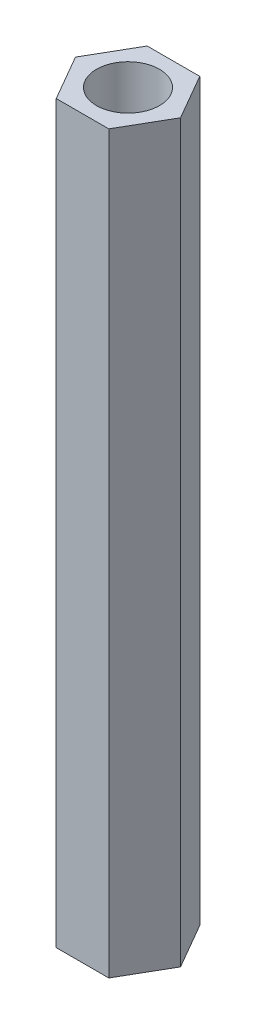
ISO-10303-21;
HEADER;
FILE_DESCRIPTION(('STEP AP214'),'2;1');
FILE_NAME('part.step','',(''),(''),'','','');
FILE_SCHEMA(('AUTOMOTIVE_DESIGN { 1 0 10303 214 1 1 1 1 }'));
ENDSEC;
DATA;
#1=APPLICATION_CONTEXT('core data for automotive mechanical design processes');
#2=APPLICATION_PROTOCOL_DEFINITION('international standard','automotive_design',2000,#1);
#3=PRODUCT_CONTEXT('',#1,'mechanical');
#4=PRODUCT('Part','Part','',(#3));
#5=PRODUCT_RELATED_PRODUCT_CATEGORY('part','',(#4));
#6=PRODUCT_DEFINITION_FORMATION('','',#4);
#7=PRODUCT_DEFINITION_CONTEXT('part definition',#1,'design');
#8=PRODUCT_DEFINITION('design','',#6,#7);
#9=PRODUCT_DEFINITION_SHAPE('','',#8);
#10=(LENGTH_UNIT() NAMED_UNIT(*) SI_UNIT(.MILLI.,.METRE.));
#11=(NAMED_UNIT(*) PLANE_ANGLE_UNIT() SI_UNIT($,.RADIAN.));
#12=(NAMED_UNIT(*) SI_UNIT($,.STERADIAN.) SOLID_ANGLE_UNIT());
#13=UNCERTAINTY_MEASURE_WITH_UNIT(LENGTH_MEASURE(1.E-05),#10,'distance_accuracy_value','');
#14=(GEOMETRIC_REPRESENTATION_CONTEXT(3) GLOBAL_UNCERTAINTY_ASSIGNED_CONTEXT((#13)) GLOBAL_UNIT_ASSIGNED_CONTEXT((#10,
#11,#12)) REPRESENTATION_CONTEXT('',''));
#15=CARTESIAN_POINT('',(0.,0.,0.));
#16=DIRECTION('',(0.,0.,1.));
#17=DIRECTION('',(1.,0.,0.));
#18=AXIS2_PLACEMENT_3D('',#15,#16,#17);
#19=CARTESIAN_POINT('',(1.25,35.,2.1650635094611));
#20=DIRECTION('',(-0.866025403784439,0.,-0.5));
#21=DIRECTION('',(-0.5,0.,0.866025403784439));
#22=AXIS2_PLACEMENT_3D('',#19,#20,#21);
#23=PLANE('',#22);
#24=DIRECTION('',(0.5,0.,-0.866025403784439));
#25=VECTOR('',#24,1.);
#26=CARTESIAN_POINT('',(1.25,0.,2.1650635094611));
#27=LINE('',#26,#25);
#28=CARTESIAN_POINT('',(1.25,0.,2.1650635094611));
#29=VERTEX_POINT('',#28);
#30=CARTESIAN_POINT('',(2.5,0.,0.));
#31=VERTEX_POINT('',#30);
#32=EDGE_CURVE('E116',#29,#31,#27,.T.);
#33=ORIENTED_EDGE('',*,*,#32,.T.);
#34=DIRECTION('',(0.,-1.,0.));
#35=VECTOR('',#34,1.);
#36=CARTESIAN_POINT('',(2.5,35.,0.));
#37=LINE('',#36,#35);
#38=CARTESIAN_POINT('',(2.5,35.,0.));
#39=VERTEX_POINT('',#38);
#40=EDGE_CURVE('E11',#39,#31,#37,.T.);
#41=ORIENTED_EDGE('',*,*,#40,.F.);
#42=DIRECTION('',(0.5,0.,-0.866025403784439));
#43=VECTOR('',#42,1.);
#44=CARTESIAN_POINT('',(1.25,35.,2.1650635094611));
#45=LINE('',#44,#43);
#46=CARTESIAN_POINT('',(1.25,35.,2.1650635094611));
#47=VERTEX_POINT('',#46);
#48=EDGE_CURVE('E127',#47,#39,#45,.T.);
#49=ORIENTED_EDGE('',*,*,#48,.F.);
#50=DIRECTION('',(0.,-1.,0.));
#51=VECTOR('',#50,1.);
#52=CARTESIAN_POINT('',(1.25,35.,2.1650635094611));
#53=LINE('',#52,#51);
#54=EDGE_CURVE('E112',#47,#29,#53,.T.);
#55=ORIENTED_EDGE('',*,*,#54,.T.);
#56=EDGE_LOOP('',(#33,#41,#49,#55));
#57=FACE_BOUND('',#56,.T.);
#58=ADVANCED_FACE('F32',(#57),#23,.F.);
#59=CARTESIAN_POINT('',(2.5,35.,0.));
#60=DIRECTION('',(-0.866025403784439,0.,0.5));
#61=DIRECTION('',(0.5,0.,0.866025403784439));
#62=AXIS2_PLACEMENT_3D('',#59,#60,#61);
#63=PLANE('',#62);
#64=DIRECTION('',(-0.5,0.,-0.866025403784438));
#65=VECTOR('',#64,1.);
#66=CARTESIAN_POINT('',(2.5,0.,0.));
#67=LINE('',#66,#65);
#68=CARTESIAN_POINT('',(1.25,0.,-2.1650635094611));
#69=VERTEX_POINT('',#68);
#70=EDGE_CURVE('E119',#31,#69,#67,.T.);
#71=ORIENTED_EDGE('',*,*,#70,.T.);
#72=DIRECTION('',(0.,-1.,0.));
#73=VECTOR('',#72,1.);
#74=CARTESIAN_POINT('',(1.25,35.,-2.1650635094611));
#75=LINE('',#74,#73);
#76=CARTESIAN_POINT('',(1.25,35.,-2.1650635094611));
#77=VERTEX_POINT('',#76);
#78=EDGE_CURVE('E40',#77,#69,#75,.T.);
#79=ORIENTED_EDGE('',*,*,#78,.F.);
#80=DIRECTION('',(-0.5,0.,-0.866025403784438));
#81=VECTOR('',#80,1.);
#82=CARTESIAN_POINT('',(2.5,35.,0.));
#83=LINE('',#82,#81);
#84=EDGE_CURVE('E85',#39,#77,#83,.T.);
#85=ORIENTED_EDGE('',*,*,#84,.F.);
#86=ORIENTED_EDGE('',*,*,#40,.T.);
#87=EDGE_LOOP('',(#71,#79,#85,#86));
#88=FACE_BOUND('',#87,.T.);
#89=ADVANCED_FACE('F152',(#88),#63,.F.);
#90=CARTESIAN_POINT('',(1.25,35.,-2.1650635094611));
#91=DIRECTION('',(0.,0.,1.));
#92=DIRECTION('',(1.,0.,0.));
#93=AXIS2_PLACEMENT_3D('',#90,#91,#92);
#94=PLANE('',#93);
#95=DIRECTION('',(-1.,0.,0.));
#96=VECTOR('',#95,1.);
#97=CARTESIAN_POINT('',(1.25,0.,-2.1650635094611));
#98=LINE('',#97,#96);
#99=CARTESIAN_POINT('',(-1.25,0.,-2.1650635094611));
#100=VERTEX_POINT('',#99);
#101=EDGE_CURVE('E122',#69,#100,#98,.T.);
#102=ORIENTED_EDGE('',*,*,#101,.T.);
#103=DIRECTION('',(0.,-1.,0.));
#104=VECTOR('',#103,1.);
#105=CARTESIAN_POINT('',(-1.25,35.,-2.1650635094611));
#106=LINE('',#105,#104);
#107=CARTESIAN_POINT('',(-1.25,35.,-2.1650635094611));
#108=VERTEX_POINT('',#107);
#109=EDGE_CURVE('E107',#108,#100,#106,.T.);
#110=ORIENTED_EDGE('',*,*,#109,.F.);
#111=DIRECTION('',(-1.,0.,0.));
#112=VECTOR('',#111,1.);
#113=CARTESIAN_POINT('',(1.25,35.,-2.1650635094611));
#114=LINE('',#113,#112);
#115=EDGE_CURVE('E98',#77,#108,#114,.T.);
#116=ORIENTED_EDGE('',*,*,#115,.F.);
#117=ORIENTED_EDGE('',*,*,#78,.T.);
#118=EDGE_LOOP('',(#102,#110,#116,#117));
#119=FACE_BOUND('',#118,.T.);
#120=ADVANCED_FACE('F133',(#119),#94,.F.);
#121=CARTESIAN_POINT('',(-1.25,35.,-2.1650635094611));
#122=DIRECTION('',(0.866025403784439,0.,0.5));
#123=DIRECTION('',(0.5,0.,-0.866025403784439));
#124=AXIS2_PLACEMENT_3D('',#121,#122,#123);
#125=PLANE('',#124);
#126=DIRECTION('',(-0.5,0.,0.866025403784439));
#127=VECTOR('',#126,1.);
#128=CARTESIAN_POINT('',(-1.25,0.,-2.1650635094611));
#129=LINE('',#128,#127);
#130=CARTESIAN_POINT('',(-2.5,0.,0.));
#131=VERTEX_POINT('',#130);
#132=EDGE_CURVE('E106',#100,#131,#129,.T.);
#133=ORIENTED_EDGE('',*,*,#132,.T.);
#134=DIRECTION('',(0.,-1.,0.));
#135=VECTOR('',#134,1.);
#136=CARTESIAN_POINT('',(-2.5,35.,0.));
#137=LINE('',#136,#135);
#138=CARTESIAN_POINT('',(-2.5,35.,0.));
#139=VERTEX_POINT('',#138);
#140=EDGE_CURVE('E103',#139,#131,#137,.T.);
#141=ORIENTED_EDGE('',*,*,#140,.F.);
#142=DIRECTION('',(-0.5,0.,0.866025403784439));
#143=VECTOR('',#142,1.);
#144=CARTESIAN_POINT('',(-1.25,35.,-2.1650635094611));
#145=LINE('',#144,#143);
#146=EDGE_CURVE('E92',#108,#139,#145,.T.);
#147=ORIENTED_EDGE('',*,*,#146,.F.);
#148=ORIENTED_EDGE('',*,*,#109,.T.);
#149=EDGE_LOOP('',(#133,#141,#147,#148));
#150=FACE_BOUND('',#149,.T.);
#151=ADVANCED_FACE('F104',(#150),#125,.F.);
#152=CARTESIAN_POINT('',(-2.5,35.,0.));
#153=DIRECTION('',(0.866025403784439,0.,-0.5));
#154=DIRECTION('',(-0.5,0.,-0.866025403784439));
#155=AXIS2_PLACEMENT_3D('',#152,#153,#154);
#156=PLANE('',#155);
#157=DIRECTION('',(0.5,0.,0.866025403784439));
#158=VECTOR('',#157,1.);
#159=CARTESIAN_POINT('',(-2.5,0.,0.));
#160=LINE('',#159,#158);
#161=CARTESIAN_POINT('',(-1.25,0.,2.1650635094611));
#162=VERTEX_POINT('',#161);
#163=EDGE_CURVE('E71',#131,#162,#160,.T.);
#164=ORIENTED_EDGE('',*,*,#163,.T.);
#165=DIRECTION('',(0.,-1.,0.));
#166=VECTOR('',#165,1.);
#167=CARTESIAN_POINT('',(-1.25,35.,2.1650635094611));
#168=LINE('',#167,#166);
#169=CARTESIAN_POINT('',(-1.25,35.,2.1650635094611));
#170=VERTEX_POINT('',#169);
#171=EDGE_CURVE('E108',#170,#162,#168,.T.);
#172=ORIENTED_EDGE('',*,*,#171,.F.);
#173=DIRECTION('',(0.5,0.,0.866025403784439));
#174=VECTOR('',#173,1.);
#175=CARTESIAN_POINT('',(-2.5,35.,0.));
#176=LINE('',#175,#174);
#177=EDGE_CURVE('E96',#139,#170,#176,.T.);
#178=ORIENTED_EDGE('',*,*,#177,.F.);
#179=ORIENTED_EDGE('',*,*,#140,.T.);
#180=EDGE_LOOP('',(#164,#172,#178,#179));
#181=FACE_BOUND('',#180,.T.);
#182=ADVANCED_FACE('F110',(#181),#156,.F.);
#183=CARTESIAN_POINT('',(-1.25,35.,2.1650635094611));
#184=DIRECTION('',(0.,0.,-1.));
#185=DIRECTION('',(-1.,0.,0.));
#186=AXIS2_PLACEMENT_3D('',#183,#184,#185);
#187=PLANE('',#186);
#188=DIRECTION('',(1.,0.,0.));
#189=VECTOR('',#188,1.);
#190=CARTESIAN_POINT('',(-1.25,0.,2.1650635094611));
#191=LINE('',#190,#189);
#192=EDGE_CURVE('E77',#162,#29,#191,.T.);
#193=ORIENTED_EDGE('',*,*,#192,.T.);
#194=ORIENTED_EDGE('',*,*,#54,.F.);
#195=DIRECTION('',(1.,0.,0.));
#196=VECTOR('',#195,1.);
#197=CARTESIAN_POINT('',(-1.25,35.,2.1650635094611));
#198=LINE('',#197,#196);
#199=EDGE_CURVE('E48',#170,#47,#198,.T.);
#200=ORIENTED_EDGE('',*,*,#199,.F.);
#201=ORIENTED_EDGE('',*,*,#171,.T.);
#202=EDGE_LOOP('',(#193,#194,#200,#201));
#203=FACE_BOUND('',#202,.T.);
#204=ADVANCED_FACE('F140',(#203),#187,.F.);
#205=CARTESIAN_POINT('',(0.,35.,0.));
#206=DIRECTION('',(0.,1.,0.));
#207=DIRECTION('',(0.,0.,1.));
#208=AXIS2_PLACEMENT_3D('',#205,#206,#207);
#209=PLANE('',#208);
#210=CARTESIAN_POINT('',(0.,35.,0.));
#211=DIRECTION('',(0.,1.,0.));
#212=DIRECTION('',(0.,0.,1.));
#213=AXIS2_PLACEMENT_3D('',#210,#211,#212);
#214=CIRCLE('',#213,1.5);
#215=CARTESIAN_POINT('',(0.,35.,1.5));
#216=VERTEX_POINT('',#215);
#217=EDGE_CURVE('E235',#216,#216,#214,.T.);
#218=ORIENTED_EDGE('',*,*,#217,.F.);
#219=EDGE_LOOP('',(#218));
#220=FACE_BOUND('',#219,.T.);
#221=ORIENTED_EDGE('',*,*,#48,.T.);
#222=ORIENTED_EDGE('',*,*,#84,.T.);
#223=ORIENTED_EDGE('',*,*,#115,.T.);
#224=ORIENTED_EDGE('',*,*,#146,.T.);
#225=ORIENTED_EDGE('',*,*,#177,.T.);
#226=ORIENTED_EDGE('',*,*,#199,.T.);
#227=EDGE_LOOP('',(#221,#222,#223,#224,#225,#226));
#228=FACE_BOUND('',#227,.T.);
#229=ADVANCED_FACE('F94',(#220,#228),#209,.T.);
#230=CARTESIAN_POINT('',(0.,0.,0.));
#231=DIRECTION('',(0.,1.,0.));
#232=DIRECTION('',(0.,0.,1.));
#233=AXIS2_PLACEMENT_3D('',#230,#231,#232);
#234=PLANE('',#233);
#235=CARTESIAN_POINT('',(0.,0.,0.));
#236=DIRECTION('',(0.,-1.,0.));
#237=DIRECTION('',(0.,0.,-1.));
#238=AXIS2_PLACEMENT_3D('',#235,#236,#237);
#239=CIRCLE('',#238,1.5);
#240=CARTESIAN_POINT('',(0.,0.,-1.5));
#241=VERTEX_POINT('',#240);
#242=EDGE_CURVE('E236',#241,#241,#239,.T.);
#243=ORIENTED_EDGE('',*,*,#242,.F.);
#244=EDGE_LOOP('',(#243));
#245=FACE_BOUND('',#244,.T.);
#246=ORIENTED_EDGE('',*,*,#32,.F.);
#247=ORIENTED_EDGE('',*,*,#192,.F.);
#248=ORIENTED_EDGE('',*,*,#163,.F.);
#249=ORIENTED_EDGE('',*,*,#132,.F.);
#250=ORIENTED_EDGE('',*,*,#101,.F.);
#251=ORIENTED_EDGE('',*,*,#70,.F.);
#252=EDGE_LOOP('',(#246,#247,#248,#249,#250,#251));
#253=FACE_BOUND('',#252,.T.);
#254=ADVANCED_FACE('F136',(#245,#253),#234,.F.);
#255=CARTESIAN_POINT('',(0.,27.,0.));
#256=DIRECTION('',(0.,1.,0.));
#257=DIRECTION('',(0.,0.,1.));
#258=AXIS2_PLACEMENT_3D('',#255,#256,#257);
#259=CYLINDRICAL_SURFACE('',#258,1.5);
#260=CARTESIAN_POINT('',(0.,27.,0.));
#261=DIRECTION('',(0.,1.,0.));
#262=DIRECTION('',(0.,0.,1.));
#263=AXIS2_PLACEMENT_3D('',#260,#261,#262);
#264=CIRCLE('',#263,1.5);
#265=CARTESIAN_POINT('',(0.,27.,1.5));
#266=VERTEX_POINT('',#265);
#267=EDGE_CURVE('E120',#266,#266,#264,.T.);
#268=ORIENTED_EDGE('',*,*,#267,.F.);
#269=EDGE_LOOP('',(#268));
#270=FACE_BOUND('',#269,.T.);
#271=ORIENTED_EDGE('',*,*,#217,.T.);
#272=EDGE_LOOP('',(#271));
#273=FACE_BOUND('',#272,.T.);
#274=ADVANCED_FACE('F187',(#270,#273),#259,.F.);
#275=CARTESIAN_POINT('',(0.,27.,0.));
#276=DIRECTION('',(0.,1.,0.));
#277=DIRECTION('',(0.,0.,1.));
#278=AXIS2_PLACEMENT_3D('',#275,#276,#277);
#279=PLANE('',#278);
#280=ORIENTED_EDGE('',*,*,#267,.T.);
#281=EDGE_LOOP('',(#280));
#282=FACE_BOUND('',#281,.T.);
#283=ADVANCED_FACE('F192',(#282),#279,.T.);
#284=CARTESIAN_POINT('',(0.,8.,0.));
#285=DIRECTION('',(0.,-1.,0.));
#286=DIRECTION('',(0.,0.,-1.));
#287=AXIS2_PLACEMENT_3D('',#284,#285,#286);
#288=CYLINDRICAL_SURFACE('',#287,1.5);
#289=CARTESIAN_POINT('',(0.,8.,0.));
#290=DIRECTION('',(0.,-1.,0.));
#291=DIRECTION('',(0.,0.,-1.));
#292=AXIS2_PLACEMENT_3D('',#289,#290,#291);
#293=CIRCLE('',#292,1.5);
#294=CARTESIAN_POINT('',(0.,8.,-1.5));
#295=VERTEX_POINT('',#294);
#296=EDGE_CURVE('E234',#295,#295,#293,.T.);
#297=ORIENTED_EDGE('',*,*,#296,.F.);
#298=EDGE_LOOP('',(#297));
#299=FACE_BOUND('',#298,.T.);
#300=ORIENTED_EDGE('',*,*,#242,.T.);
#301=EDGE_LOOP('',(#300));
#302=FACE_BOUND('',#301,.T.);
#303=ADVANCED_FACE('F202',(#299,#302),#288,.F.);
#304=CARTESIAN_POINT('',(0.,8.,0.));
#305=DIRECTION('',(0.,-1.,0.));
#306=DIRECTION('',(0.,0.,-1.));
#307=AXIS2_PLACEMENT_3D('',#304,#305,#306);
#308=PLANE('',#307);
#309=ORIENTED_EDGE('',*,*,#296,.T.);
#310=EDGE_LOOP('',(#309));
#311=FACE_BOUND('',#310,.T.);
#312=ADVANCED_FACE('F218',(#311),#308,.T.);
#313=CLOSED_SHELL('',(#58,#89,#120,#151,#182,#204,#229,#254,#274,#283,#303,#312));
#314=MANIFOLD_SOLID_BREP('B2',#313);
#315=ADVANCED_BREP_SHAPE_REPRESENTATION('',(#18,#314),#14);
#316=SHAPE_DEFINITION_REPRESENTATION(#9,#315);
ENDSEC;
END-ISO-10303-21;
